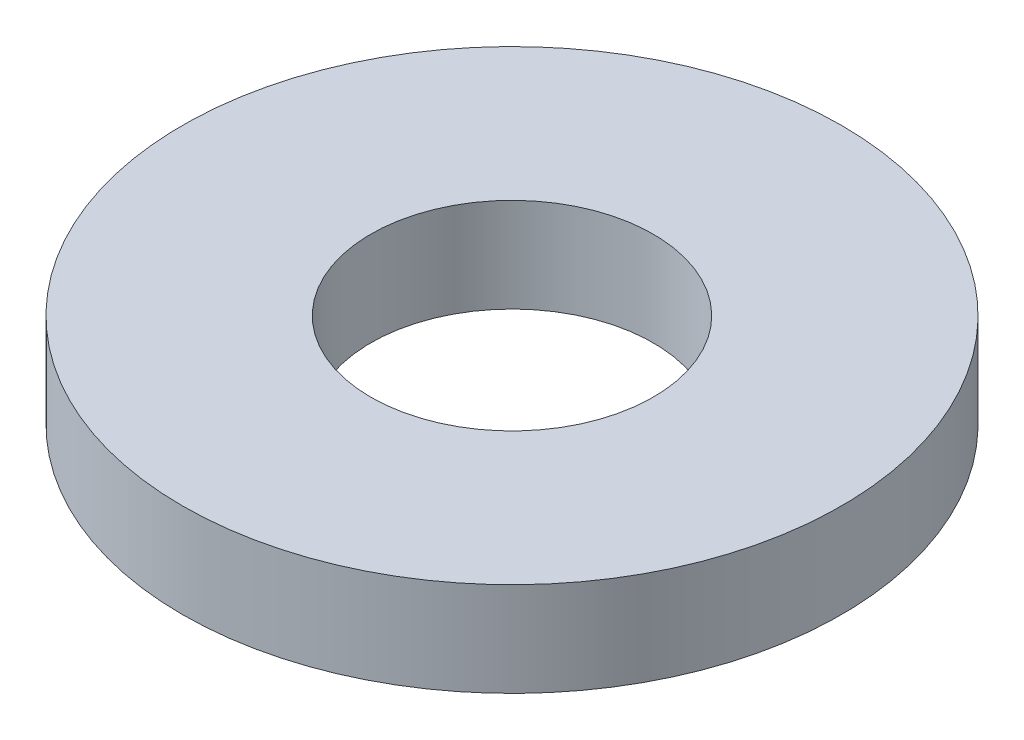
ISO-10303-21;
HEADER;
FILE_DESCRIPTION(('STEP AP214'),'2;1');
FILE_NAME('part.step','',(''),(''),'','','');
FILE_SCHEMA(('AUTOMOTIVE_DESIGN { 1 0 10303 214 1 1 1 1 }'));
ENDSEC;
DATA;
#1=APPLICATION_CONTEXT('core data for automotive mechanical design processes');
#2=APPLICATION_PROTOCOL_DEFINITION('international standard','automotive_design',2000,#1);
#3=PRODUCT_CONTEXT('',#1,'mechanical');
#4=PRODUCT('Part','Part','',(#3));
#5=PRODUCT_RELATED_PRODUCT_CATEGORY('part','',(#4));
#6=PRODUCT_DEFINITION_FORMATION('','',#4);
#7=PRODUCT_DEFINITION_CONTEXT('part definition',#1,'design');
#8=PRODUCT_DEFINITION('design','',#6,#7);
#9=PRODUCT_DEFINITION_SHAPE('','',#8);
#10=(LENGTH_UNIT() NAMED_UNIT(*) SI_UNIT(.MILLI.,.METRE.));
#11=(NAMED_UNIT(*) PLANE_ANGLE_UNIT() SI_UNIT($,.RADIAN.));
#12=(NAMED_UNIT(*) SI_UNIT($,.STERADIAN.) SOLID_ANGLE_UNIT());
#13=UNCERTAINTY_MEASURE_WITH_UNIT(LENGTH_MEASURE(1.E-05),#10,'distance_accuracy_value','');
#14=(GEOMETRIC_REPRESENTATION_CONTEXT(3) GLOBAL_UNCERTAINTY_ASSIGNED_CONTEXT((#13)) GLOBAL_UNIT_ASSIGNED_CONTEXT((#10,
#11,#12)) REPRESENTATION_CONTEXT('',''));
#15=CARTESIAN_POINT('',(0.,0.,0.));
#16=DIRECTION('',(0.,0.,1.));
#17=DIRECTION('',(1.,0.,0.));
#18=AXIS2_PLACEMENT_3D('',#15,#16,#17);
#19=CARTESIAN_POINT('',(0.,1.5875,0.));
#20=DIRECTION('',(0.,1.,0.));
#21=DIRECTION('',(0.,0.,1.));
#22=AXIS2_PLACEMENT_3D('',#19,#20,#21);
#23=PLANE('',#22);
#24=CARTESIAN_POINT('',(0.,1.5875,0.));
#25=DIRECTION('',(0.,1.,0.));
#26=DIRECTION('',(0.,0.,1.));
#27=AXIS2_PLACEMENT_3D('',#24,#25,#26);
#28=CIRCLE('',#27,5.55625);
#29=CARTESIAN_POINT('',(0.,1.5875,5.55625));
#30=VERTEX_POINT('',#29);
#31=EDGE_CURVE('E10',#30,#30,#28,.T.);
#32=ORIENTED_EDGE('',*,*,#31,.T.);
#33=EDGE_LOOP('',(#32));
#34=FACE_BOUND('',#33,.T.);
#35=CARTESIAN_POINT('',(0.,1.5875,0.));
#36=DIRECTION('',(0.,1.,0.));
#37=DIRECTION('',(0.,0.,1.));
#38=AXIS2_PLACEMENT_3D('',#35,#36,#37);
#39=CIRCLE('',#38,2.38125);
#40=CARTESIAN_POINT('',(0.,1.5875,2.38125));
#41=VERTEX_POINT('',#40);
#42=EDGE_CURVE('E41',#41,#41,#39,.T.);
#43=ORIENTED_EDGE('',*,*,#42,.F.);
#44=EDGE_LOOP('',(#43));
#45=FACE_BOUND('',#44,.T.);
#46=ADVANCED_FACE('F30',(#34,#45),#23,.T.);
#47=CARTESIAN_POINT('',(0.,0.,0.));
#48=DIRECTION('',(0.,1.,0.));
#49=DIRECTION('',(0.,0.,1.));
#50=AXIS2_PLACEMENT_3D('',#47,#48,#49);
#51=PLANE('',#50);
#52=CARTESIAN_POINT('',(0.,0.,0.));
#53=DIRECTION('',(0.,1.,0.));
#54=DIRECTION('',(0.,0.,1.));
#55=AXIS2_PLACEMENT_3D('',#52,#53,#54);
#56=CIRCLE('',#55,5.55625);
#57=CARTESIAN_POINT('',(0.,0.,5.55625));
#58=VERTEX_POINT('',#57);
#59=EDGE_CURVE('E34',#58,#58,#56,.T.);
#60=ORIENTED_EDGE('',*,*,#59,.F.);
#61=EDGE_LOOP('',(#60));
#62=FACE_BOUND('',#61,.T.);
#63=CARTESIAN_POINT('',(0.,0.,0.));
#64=DIRECTION('',(0.,1.,0.));
#65=DIRECTION('',(0.,0.,1.));
#66=AXIS2_PLACEMENT_3D('',#63,#64,#65);
#67=CIRCLE('',#66,2.38125);
#68=CARTESIAN_POINT('',(0.,0.,2.38125));
#69=VERTEX_POINT('',#68);
#70=EDGE_CURVE('E43',#69,#69,#67,.T.);
#71=ORIENTED_EDGE('',*,*,#70,.T.);
#72=EDGE_LOOP('',(#71));
#73=FACE_BOUND('',#72,.T.);
#74=ADVANCED_FACE('F53',(#62,#73),#51,.F.);
#75=CARTESIAN_POINT('',(0.,1.5875,0.));
#76=DIRECTION('',(0.,-1.,0.));
#77=DIRECTION('',(0.,0.,-1.));
#78=AXIS2_PLACEMENT_3D('',#75,#76,#77);
#79=CYLINDRICAL_SURFACE('',#78,5.55625);
#80=ORIENTED_EDGE('',*,*,#31,.F.);
#81=EDGE_LOOP('',(#80));
#82=FACE_BOUND('',#81,.T.);
#83=ORIENTED_EDGE('',*,*,#59,.T.);
#84=EDGE_LOOP('',(#83));
#85=FACE_BOUND('',#84,.T.);
#86=ADVANCED_FACE('F32',(#82,#85),#79,.T.);
#87=CARTESIAN_POINT('',(0.,1.5875,0.));
#88=DIRECTION('',(0.,-1.,0.));
#89=DIRECTION('',(0.,0.,-1.));
#90=AXIS2_PLACEMENT_3D('',#87,#88,#89);
#91=CYLINDRICAL_SURFACE('',#90,2.38125);
#92=ORIENTED_EDGE('',*,*,#42,.T.);
#93=EDGE_LOOP('',(#92));
#94=FACE_BOUND('',#93,.T.);
#95=ORIENTED_EDGE('',*,*,#70,.F.);
#96=EDGE_LOOP('',(#95));
#97=FACE_BOUND('',#96,.T.);
#98=ADVANCED_FACE('F49',(#94,#97),#91,.F.);
#99=CLOSED_SHELL('',(#46,#74,#86,#98));
#100=MANIFOLD_SOLID_BREP('B2',#99);
#101=ADVANCED_BREP_SHAPE_REPRESENTATION('',(#18,#100),#14);
#102=SHAPE_DEFINITION_REPRESENTATION(#9,#101);
ENDSEC;
END-ISO-10303-21;
